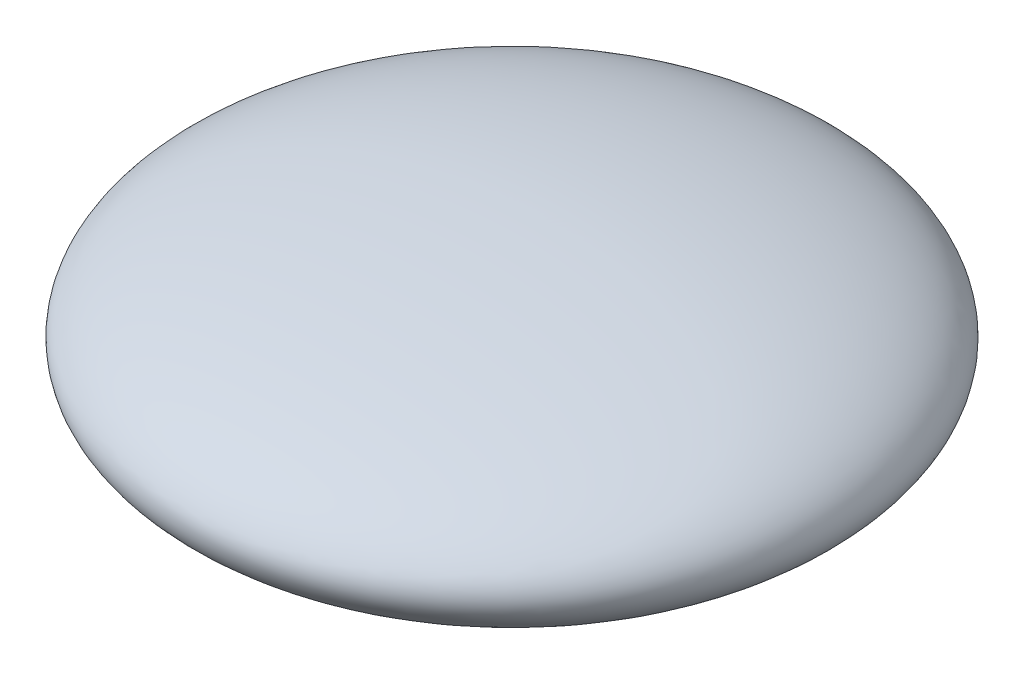
ISO-10303-21;
HEADER;
FILE_DESCRIPTION(('STEP AP214'),'2;1');
FILE_NAME('part.step','',(''),(''),'','','');
FILE_SCHEMA(('AUTOMOTIVE_DESIGN { 1 0 10303 214 1 1 1 1 }'));
ENDSEC;
DATA;
#1=APPLICATION_CONTEXT('core data for automotive mechanical design processes');
#2=APPLICATION_PROTOCOL_DEFINITION('international standard','automotive_design',2000,#1);
#3=PRODUCT_CONTEXT('',#1,'mechanical');
#4=PRODUCT('Part','Part','',(#3));
#5=PRODUCT_RELATED_PRODUCT_CATEGORY('part','',(#4));
#6=PRODUCT_DEFINITION_FORMATION('','',#4);
#7=PRODUCT_DEFINITION_CONTEXT('part definition',#1,'design');
#8=PRODUCT_DEFINITION('design','',#6,#7);
#9=PRODUCT_DEFINITION_SHAPE('','',#8);
#10=(LENGTH_UNIT() NAMED_UNIT(*) SI_UNIT(.MILLI.,.METRE.));
#11=(NAMED_UNIT(*) PLANE_ANGLE_UNIT() SI_UNIT($,.RADIAN.));
#12=(NAMED_UNIT(*) SI_UNIT($,.STERADIAN.) SOLID_ANGLE_UNIT());
#13=UNCERTAINTY_MEASURE_WITH_UNIT(LENGTH_MEASURE(1.E-05),#10,'distance_accuracy_value','');
#14=(GEOMETRIC_REPRESENTATION_CONTEXT(3) GLOBAL_UNCERTAINTY_ASSIGNED_CONTEXT((#13)) GLOBAL_UNIT_ASSIGNED_CONTEXT((#10,
#11,#12)) REPRESENTATION_CONTEXT('',''));
#15=CARTESIAN_POINT('',(0.,0.,0.));
#16=DIRECTION('',(0.,0.,1.));
#17=DIRECTION('',(1.,0.,0.));
#18=AXIS2_PLACEMENT_3D('',#15,#16,#17);
#19=CARTESIAN_POINT('',(0.,0.,0.));
#20=DIRECTION('',(0.,1.,0.));
#21=DIRECTION('',(0.,0.,1.));
#22=AXIS2_PLACEMENT_3D('',#19,#20,#21);
#23=CONICAL_SURFACE('',#22,14.85,1.10037122564234);
#24=CARTESIAN_POINT('',(0.,3.49999999458314,0.));
#25=DIRECTION('',(0.,-1.,0.));
#26=DIRECTION('',(0.,0.,-1.));
#27=AXIS2_PLACEMENT_3D('',#24,#25,#26);
#28=CIRCLE('',#27,21.7329783119135);
#29=CARTESIAN_POINT('',(0.,3.49999999458314,-21.7329783119135));
#30=VERTEX_POINT('',#29);
#31=EDGE_CURVE('E11',#30,#30,#28,.T.);
#32=ORIENTED_EDGE('',*,*,#31,.T.);
#33=EDGE_LOOP('',(#32));
#34=FACE_BOUND('',#33,.T.);
#35=CARTESIAN_POINT('',(0.,0.,0.));
#36=DIRECTION('',(0.,-1.,0.));
#37=DIRECTION('',(0.,0.,-1.));
#38=AXIS2_PLACEMENT_3D('',#35,#36,#37);
#39=CIRCLE('',#38,14.85);
#40=CARTESIAN_POINT('',(0.,0.,-14.85));
#41=VERTEX_POINT('',#40);
#42=EDGE_CURVE('E51',#41,#41,#39,.T.);
#43=ORIENTED_EDGE('',*,*,#42,.F.);
#44=EDGE_LOOP('',(#43));
#45=FACE_BOUND('',#44,.T.);
#46=ADVANCED_FACE('F45',(#34,#45),#23,.T.);
#47=CARTESIAN_POINT('',(0.,7.07229958,0.));
#48=DIRECTION('',(0.,0.,1.));
#49=DIRECTION('',(1.,0.,0.));
#50=AXIS2_PLACEMENT_3D('',#47,#48,#49);
#51=ELLIPSE('',#50,25.,7.22770042);
#52=TRIMMED_CURVE('',#51,(PARAMETER_VALUE(4.71238898038469)),
(PARAMETER_VALUE(7.85398163397448)),.T.,.PARAMETER.);
#53=CARTESIAN_POINT('',(0.,0.,0.));
#54=DIRECTION('',(0.,-1.,0.));
#55=AXIS1_PLACEMENT('',#53,#54);
#56=SURFACE_OF_REVOLUTION('',#52,#55);
#57=CARTESIAN_POINT('',(0.,14.3,0.));
#58=VERTEX_POINT('',#57);
#59=VERTEX_LOOP('',#58);
#60=FACE_BOUND('',#59,.T.);
#61=ORIENTED_EDGE('',*,*,#31,.F.);
#62=EDGE_LOOP('',(#61));
#63=FACE_BOUND('',#62,.T.);
#64=ADVANCED_FACE('F54',(#60,#63),#56,.F.);
#65=CARTESIAN_POINT('',(0.,0.,0.));
#66=DIRECTION('',(0.,-1.,0.));
#67=DIRECTION('',(0.,0.,-1.));
#68=AXIS2_PLACEMENT_3D('',#65,#66,#67);
#69=PLANE('',#68);
#70=ORIENTED_EDGE('',*,*,#42,.T.);
#71=EDGE_LOOP('',(#70));
#72=FACE_BOUND('',#71,.T.);
#73=ADVANCED_FACE('F57',(#72),#69,.T.);
#74=CLOSED_SHELL('',(#46,#64,#73));
#75=MANIFOLD_SOLID_BREP('B2',#74);
#76=ADVANCED_BREP_SHAPE_REPRESENTATION('',(#18,#75),#14);
#77=SHAPE_DEFINITION_REPRESENTATION(#9,#76);
ENDSEC;
END-ISO-10303-21;
